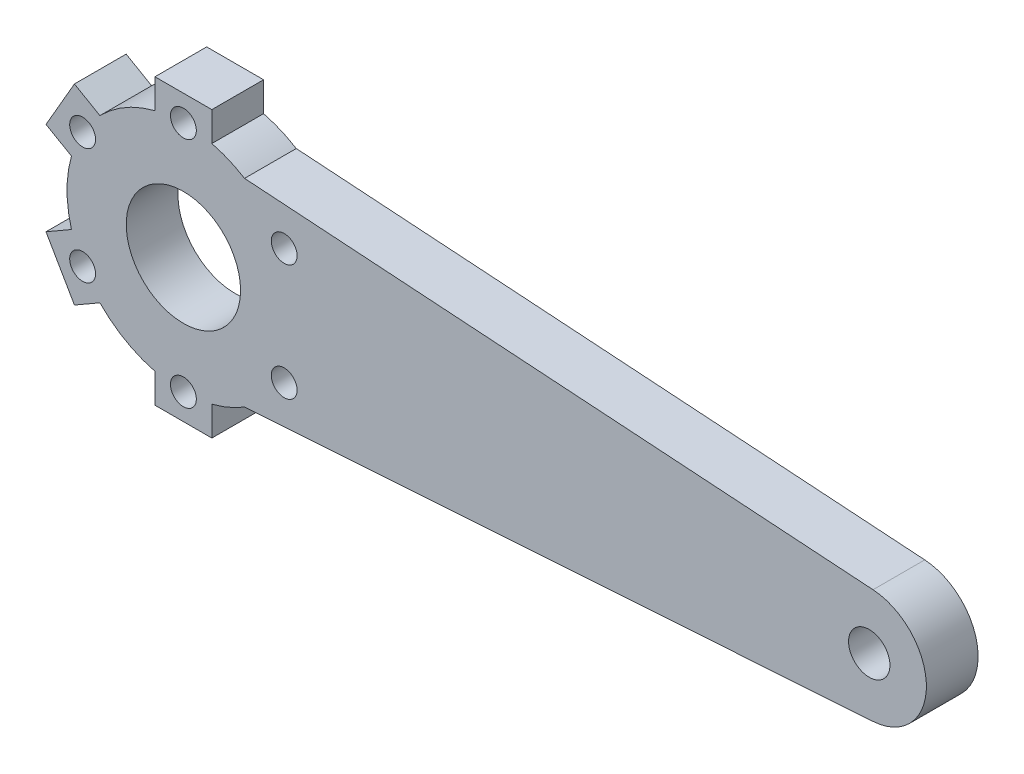
ISO-10303-21;
HEADER;
FILE_DESCRIPTION(('STEP AP214'),'2;1');
FILE_NAME('part.step','',(''),(''),'','','');
FILE_SCHEMA(('AUTOMOTIVE_DESIGN { 1 0 10303 214 1 1 1 1 }'));
ENDSEC;
DATA;
#1=APPLICATION_CONTEXT('core data for automotive mechanical design processes');
#2=APPLICATION_PROTOCOL_DEFINITION('international standard','automotive_design',2000,#1);
#3=PRODUCT_CONTEXT('',#1,'mechanical');
#4=PRODUCT('Part','Part','',(#3));
#5=PRODUCT_RELATED_PRODUCT_CATEGORY('part','',(#4));
#6=PRODUCT_DEFINITION_FORMATION('','',#4);
#7=PRODUCT_DEFINITION_CONTEXT('part definition',#1,'design');
#8=PRODUCT_DEFINITION('design','',#6,#7);
#9=PRODUCT_DEFINITION_SHAPE('','',#8);
#10=(LENGTH_UNIT() NAMED_UNIT(*) SI_UNIT(.MILLI.,.METRE.));
#11=(NAMED_UNIT(*) PLANE_ANGLE_UNIT() SI_UNIT($,.RADIAN.));
#12=(NAMED_UNIT(*) SI_UNIT($,.STERADIAN.) SOLID_ANGLE_UNIT());
#13=UNCERTAINTY_MEASURE_WITH_UNIT(LENGTH_MEASURE(1.E-05),#10,'distance_accuracy_value','');
#14=(GEOMETRIC_REPRESENTATION_CONTEXT(3) GLOBAL_UNCERTAINTY_ASSIGNED_CONTEXT((#13)) GLOBAL_UNIT_ASSIGNED_CONTEXT((#10,
#11,#12)) REPRESENTATION_CONTEXT('',''));
#15=CARTESIAN_POINT('',(0.,0.,0.));
#16=DIRECTION('',(0.,0.,1.));
#17=DIRECTION('',(1.,0.,0.));
#18=AXIS2_PLACEMENT_3D('',#15,#16,#17);
#19=CARTESIAN_POINT('',(-2.75000000000136,-4.76313972081565,10.));
#20=DIRECTION('',(0.500000000000088,0.866025403784388,0.));
#21=DIRECTION('',(-0.866025403784388,0.500000000000088,0.));
#22=AXIS2_PLACEMENT_3D('',#19,#20,#21);
#23=PLANE('',#22);
#24=DIRECTION('',(0.866025403784388,-0.500000000000088,0.));
#25=VECTOR('',#24,1.);
#26=CARTESIAN_POINT('',(-2.75000000000136,-4.76313972081565,0.));
#27=LINE('',#26,#25);
#28=CARTESIAN_POINT('',(-26.5656986040667,8.9868602791837,0.));
#29=VERTEX_POINT('',#28);
#30=CARTESIAN_POINT('',(-21.6444436276888,6.14557239381967,0.));
#31=VERTEX_POINT('',#30);
#32=EDGE_CURVE('E230',#29,#31,#27,.T.);
#33=ORIENTED_EDGE('',*,*,#32,.T.);
#34=DIRECTION('',(0.,0.,-1.));
#35=VECTOR('',#34,1.);
#36=CARTESIAN_POINT('',(-21.6444436276888,6.14557239381967,10.));
#37=LINE('',#36,#35);
#38=CARTESIAN_POINT('',(-21.6444436276888,6.14557239381967,10.));
#39=VERTEX_POINT('',#38);
#40=EDGE_CURVE('E11',#39,#31,#37,.T.);
#41=ORIENTED_EDGE('',*,*,#40,.F.);
#42=DIRECTION('',(0.866025403784388,-0.500000000000088,0.));
#43=VECTOR('',#42,1.);
#44=CARTESIAN_POINT('',(-2.75000000000136,-4.76313972081565,10.));
#45=LINE('',#44,#43);
#46=CARTESIAN_POINT('',(-26.5656986040667,8.9868602791837,10.));
#47=VERTEX_POINT('',#46);
#48=EDGE_CURVE('E295',#47,#39,#45,.T.);
#49=ORIENTED_EDGE('',*,*,#48,.F.);
#50=DIRECTION('',(0.,0.,-1.));
#51=VECTOR('',#50,1.);
#52=CARTESIAN_POINT('',(-26.5656986040667,8.9868602791837,10.));
#53=LINE('',#52,#51);
#54=EDGE_CURVE('E229',#47,#29,#53,.T.);
#55=ORIENTED_EDGE('',*,*,#54,.T.);
#56=EDGE_LOOP('',(#33,#41,#49,#55));
#57=FACE_BOUND('',#56,.T.);
#58=ADVANCED_FACE('F36',(#57),#23,.F.);
#59=CARTESIAN_POINT('',(0.,0.,10.));
#60=DIRECTION('',(0.,0.,-1.));
#61=DIRECTION('',(-1.,0.,0.));
#62=AXIS2_PLACEMENT_3D('',#59,#60,#61);
#63=CYLINDRICAL_SURFACE('',#62,22.5);
#64=CARTESIAN_POINT('',(0.,0.,0.));
#65=DIRECTION('',(0.,0.,1.));
#66=DIRECTION('',(1.,0.,0.));
#67=AXIS2_PLACEMENT_3D('',#64,#65,#66);
#68=CIRCLE('',#67,22.5);
#69=CARTESIAN_POINT('',(-21.6444436276863,-6.14557239382121,0.));
#70=VERTEX_POINT('',#69);
#71=EDGE_CURVE('E233',#31,#70,#68,.T.);
#72=ORIENTED_EDGE('',*,*,#71,.T.);
#73=DIRECTION('',(0.,0.,-1.));
#74=VECTOR('',#73,1.);
#75=CARTESIAN_POINT('',(-21.6444436276863,-6.14557239382121,10.));
#76=LINE('',#75,#74);
#77=CARTESIAN_POINT('',(-21.6444436276863,-6.14557239382121,10.));
#78=VERTEX_POINT('',#77);
#79=EDGE_CURVE('E44',#78,#70,#76,.T.);
#80=ORIENTED_EDGE('',*,*,#79,.F.);
#81=CARTESIAN_POINT('',(0.,0.,10.));
#82=DIRECTION('',(0.,0.,1.));
#83=DIRECTION('',(1.,0.,0.));
#84=AXIS2_PLACEMENT_3D('',#81,#82,#83);
#85=CIRCLE('',#84,22.5);
#86=EDGE_CURVE('E127',#39,#78,#85,.T.);
#87=ORIENTED_EDGE('',*,*,#86,.F.);
#88=ORIENTED_EDGE('',*,*,#40,.T.);
#89=EDGE_LOOP('',(#72,#80,#87,#88));
#90=FACE_BOUND('',#89,.T.);
#91=ADVANCED_FACE('F339',(#90),#63,.T.);
#92=CARTESIAN_POINT('',(-2.74999999999504,4.76313972080807,10.));
#93=DIRECTION('',(-0.499999999999823,0.866025403784541,0.));
#94=DIRECTION('',(-0.866025403784541,-0.499999999999823,0.));
#95=AXIS2_PLACEMENT_3D('',#92,#93,#94);
#96=PLANE('',#95);
#97=DIRECTION('',(0.866025403784541,0.499999999999823,0.));
#98=VECTOR('',#97,1.);
#99=CARTESIAN_POINT('',(-2.74999999999504,4.76313972080807,0.));
#100=LINE('',#99,#98);
#101=CARTESIAN_POINT('',(-26.5656986040633,-8.98686027918321,0.));
#102=VERTEX_POINT('',#101);
#103=EDGE_CURVE('E236',#102,#70,#100,.T.);
#104=ORIENTED_EDGE('',*,*,#103,.F.);
#105=DIRECTION('',(0.,0.,-1.));
#106=VECTOR('',#105,1.);
#107=CARTESIAN_POINT('',(-26.5656986040633,-8.98686027918321,10.));
#108=LINE('',#107,#106);
#109=CARTESIAN_POINT('',(-26.5656986040633,-8.98686027918321,10.));
#110=VERTEX_POINT('',#109);
#111=EDGE_CURVE('E332',#110,#102,#108,.T.);
#112=ORIENTED_EDGE('',*,*,#111,.F.);
#113=DIRECTION('',(0.866025403784541,0.499999999999823,0.));
#114=VECTOR('',#113,1.);
#115=CARTESIAN_POINT('',(-2.74999999999504,4.76313972080807,10.));
#116=LINE('',#115,#114);
#117=EDGE_CURVE('E338',#110,#78,#116,.T.);
#118=ORIENTED_EDGE('',*,*,#117,.T.);
#119=ORIENTED_EDGE('',*,*,#79,.T.);
#120=EDGE_LOOP('',(#104,#112,#118,#119));
#121=FACE_BOUND('',#120,.T.);
#122=ADVANCED_FACE('F336',(#121),#96,.T.);
#123=CARTESIAN_POINT('',(-23.8156986040682,-13.7499999999913,10.));
#124=DIRECTION('',(0.866025403784541,0.499999999999823,0.));
#125=DIRECTION('',(-0.499999999999823,0.866025403784541,0.));
#126=AXIS2_PLACEMENT_3D('',#123,#124,#125);
#127=PLANE('',#126);
#128=DIRECTION('',(0.499999999999823,-0.866025403784541,0.));
#129=VECTOR('',#128,1.);
#130=CARTESIAN_POINT('',(-23.8156986040682,-13.7499999999913,0.));
#131=LINE('',#130,#129);
#132=CARTESIAN_POINT('',(-21.0656986040652,-18.5131397208132,0.));
#133=VERTEX_POINT('',#132);
#134=EDGE_CURVE('E240',#102,#133,#131,.T.);
#135=ORIENTED_EDGE('',*,*,#134,.T.);
#136=DIRECTION('',(0.,0.,-1.));
#137=VECTOR('',#136,1.);
#138=CARTESIAN_POINT('',(-21.0656986040652,-18.5131397208132,10.));
#139=LINE('',#138,#137);
#140=CARTESIAN_POINT('',(-21.0656986040652,-18.5131397208132,10.));
#141=VERTEX_POINT('',#140);
#142=EDGE_CURVE('E329',#141,#133,#139,.T.);
#143=ORIENTED_EDGE('',*,*,#142,.F.);
#144=DIRECTION('',(0.499999999999823,-0.866025403784541,0.));
#145=VECTOR('',#144,1.);
#146=CARTESIAN_POINT('',(-23.8156986040682,-13.7499999999913,10.));
#147=LINE('',#146,#145);
#148=EDGE_CURVE('E359',#110,#141,#147,.T.);
#149=ORIENTED_EDGE('',*,*,#148,.F.);
#150=ORIENTED_EDGE('',*,*,#111,.T.);
#151=EDGE_LOOP('',(#135,#143,#149,#150));
#152=FACE_BOUND('',#151,.T.);
#153=ADVANCED_FACE('F350',(#152),#127,.F.);
#154=CARTESIAN_POINT('',(2.75000000000301,-4.76313972082188,10.));
#155=DIRECTION('',(-0.499999999999823,0.866025403784541,0.));
#156=DIRECTION('',(-0.866025403784541,-0.499999999999823,0.));
#157=AXIS2_PLACEMENT_3D('',#154,#155,#156);
#158=PLANE('',#157);
#159=DIRECTION('',(0.866025403784541,0.499999999999823,0.));
#160=VECTOR('',#159,1.);
#161=CARTESIAN_POINT('',(2.75000000000301,-4.76313972082188,0.));
#162=LINE('',#161,#160);
#163=CARTESIAN_POINT('',(-16.1444436276857,-15.6718518354518,0.));
#164=VERTEX_POINT('',#163);
#165=EDGE_CURVE('E242',#133,#164,#162,.T.);
#166=ORIENTED_EDGE('',*,*,#165,.T.);
#167=DIRECTION('',(0.,0.,-1.));
#168=VECTOR('',#167,1.);
#169=CARTESIAN_POINT('',(-16.1444436276857,-15.6718518354518,10.));
#170=LINE('',#169,#168);
#171=CARTESIAN_POINT('',(-16.1444436276857,-15.6718518354518,10.));
#172=VERTEX_POINT('',#171);
#173=EDGE_CURVE('E326',#172,#164,#170,.T.);
#174=ORIENTED_EDGE('',*,*,#173,.F.);
#175=DIRECTION('',(0.866025403784541,0.499999999999823,0.));
#176=VECTOR('',#175,1.);
#177=CARTESIAN_POINT('',(2.75000000000301,-4.76313972082188,10.));
#178=LINE('',#177,#176);
#179=EDGE_CURVE('E356',#141,#172,#178,.T.);
#180=ORIENTED_EDGE('',*,*,#179,.F.);
#181=ORIENTED_EDGE('',*,*,#142,.T.);
#182=EDGE_LOOP('',(#166,#174,#180,#181));
#183=FACE_BOUND('',#182,.T.);
#184=ADVANCED_FACE('F354',(#183),#158,.F.);
#185=CARTESIAN_POINT('',(-5.49999999999502,-21.8174242292696,0.));
#186=VERTEX_POINT('',#185);
#187=EDGE_CURVE('E237',#164,#186,#68,.T.);
#188=ORIENTED_EDGE('',*,*,#187,.T.);
#189=DIRECTION('',(0.,0.,-1.));
#190=VECTOR('',#189,1.);
#191=CARTESIAN_POINT('',(-5.49999999999502,-21.8174242292696,10.));
#192=LINE('',#191,#190);
#193=CARTESIAN_POINT('',(-5.49999999999502,-21.8174242292696,10.));
#194=VERTEX_POINT('',#193);
#195=EDGE_CURVE('E324',#194,#186,#192,.T.);
#196=ORIENTED_EDGE('',*,*,#195,.F.);
#197=EDGE_CURVE('E358',#172,#194,#85,.T.);
#198=ORIENTED_EDGE('',*,*,#197,.F.);
#199=ORIENTED_EDGE('',*,*,#173,.T.);
#200=EDGE_LOOP('',(#188,#196,#198,#199));
#201=FACE_BOUND('',#200,.T.);
#202=ADVANCED_FACE('F401',(#201),#63,.T.);
#203=CARTESIAN_POINT('',(-5.49999999998757,1.6915808691456E-12,10.));
#204=DIRECTION('',(-1.,3.07560158027167E-13,0.));
#205=DIRECTION('',(-3.07560158027167E-13,-1.,0.));
#206=AXIS2_PLACEMENT_3D('',#203,#204,#205);
#207=PLANE('',#206);
#208=DIRECTION('',(3.07560158027167E-13,1.,0.));
#209=VECTOR('',#208,1.);
#210=CARTESIAN_POINT('',(-5.49999999998757,1.6915808691456E-12,0.));
#211=LINE('',#210,#209);
#212=CARTESIAN_POINT('',(-5.49999999999603,-27.4999999999952,0.));
#213=VERTEX_POINT('',#212);
#214=EDGE_CURVE('E244',#213,#186,#211,.T.);
#215=ORIENTED_EDGE('',*,*,#214,.F.);
#216=DIRECTION('',(0.,0.,-1.));
#217=VECTOR('',#216,1.);
#218=CARTESIAN_POINT('',(-5.49999999999603,-27.4999999999952,10.));
#219=LINE('',#218,#217);
#220=CARTESIAN_POINT('',(-5.49999999999603,-27.4999999999952,10.));
#221=VERTEX_POINT('',#220);
#222=EDGE_CURVE('E322',#221,#213,#219,.T.);
#223=ORIENTED_EDGE('',*,*,#222,.F.);
#224=DIRECTION('',(3.07560158027167E-13,1.,0.));
#225=VECTOR('',#224,1.);
#226=CARTESIAN_POINT('',(-5.49999999998757,1.6915808691456E-12,10.));
#227=LINE('',#226,#225);
#228=EDGE_CURVE('E361',#221,#194,#227,.T.);
#229=ORIENTED_EDGE('',*,*,#228,.T.);
#230=ORIENTED_EDGE('',*,*,#195,.T.);
#231=EDGE_LOOP('',(#215,#223,#229,#230));
#232=FACE_BOUND('',#231,.T.);
#233=ADVANCED_FACE('F406',(#232),#207,.T.);
#234=CARTESIAN_POINT('',(-8.4481033280061E-12,-27.4999999999969,10.));
#235=DIRECTION('',(3.07203757382075E-13,1.,0.));
#236=DIRECTION('',(-1.,3.07203757382075E-13,0.));
#237=AXIS2_PLACEMENT_3D('',#234,#235,#236);
#238=PLANE('',#237);
#239=DIRECTION('',(1.,-3.07203757382075E-13,0.));
#240=VECTOR('',#239,1.);
#241=CARTESIAN_POINT('',(-8.4481033280061E-12,-27.4999999999969,0.));
#242=LINE('',#241,#240);
#243=CARTESIAN_POINT('',(5.50000000000397,-27.4999999999986,0.));
#244=VERTEX_POINT('',#243);
#245=EDGE_CURVE('E247',#213,#244,#242,.T.);
#246=ORIENTED_EDGE('',*,*,#245,.T.);
#247=DIRECTION('',(0.,0.,-1.));
#248=VECTOR('',#247,1.);
#249=CARTESIAN_POINT('',(5.50000000000397,-27.4999999999986,10.));
#250=LINE('',#249,#248);
#251=CARTESIAN_POINT('',(5.50000000000397,-27.4999999999986,10.));
#252=VERTEX_POINT('',#251);
#253=EDGE_CURVE('E319',#252,#244,#250,.T.);
#254=ORIENTED_EDGE('',*,*,#253,.F.);
#255=DIRECTION('',(1.,-3.07203757382075E-13,0.));
#256=VECTOR('',#255,1.);
#257=CARTESIAN_POINT('',(-8.4481033280061E-12,-27.4999999999969,10.));
#258=LINE('',#257,#256);
#259=EDGE_CURVE('E368',#221,#252,#258,.T.);
#260=ORIENTED_EDGE('',*,*,#259,.F.);
#261=ORIENTED_EDGE('',*,*,#222,.T.);
#262=EDGE_LOOP('',(#246,#254,#260,#261));
#263=FACE_BOUND('',#262,.T.);
#264=ADVANCED_FACE('F413',(#263),#238,.F.);
#265=CARTESIAN_POINT('',(5.50000000001242,-1.6899018806975E-12,10.));
#266=DIRECTION('',(-1.,3.07254887398853E-13,0.));
#267=DIRECTION('',(-3.07254887398853E-13,-1.,0.));
#268=AXIS2_PLACEMENT_3D('',#265,#266,#267);
#269=PLANE('',#268);
#270=DIRECTION('',(3.07254887398853E-13,1.,0.));
#271=VECTOR('',#270,1.);
#272=CARTESIAN_POINT('',(5.50000000001242,-1.6899018806975E-12,0.));
#273=LINE('',#272,#271);
#274=CARTESIAN_POINT('',(5.50000000000571,-21.81742422927,0.));
#275=VERTEX_POINT('',#274);
#276=EDGE_CURVE('E249',#244,#275,#273,.T.);
#277=ORIENTED_EDGE('',*,*,#276,.T.);
#278=DIRECTION('',(0.,0.,-1.));
#279=VECTOR('',#278,1.);
#280=CARTESIAN_POINT('',(5.50000000000571,-21.81742422927,10.));
#281=LINE('',#280,#279);
#282=CARTESIAN_POINT('',(5.50000000000571,-21.81742422927,10.));
#283=VERTEX_POINT('',#282);
#284=EDGE_CURVE('E316',#283,#275,#281,.T.);
#285=ORIENTED_EDGE('',*,*,#284,.F.);
#286=DIRECTION('',(3.07254887398853E-13,1.,0.));
#287=VECTOR('',#286,1.);
#288=CARTESIAN_POINT('',(5.50000000001242,-1.6899018806975E-12,10.));
#289=LINE('',#288,#287);
#290=EDGE_CURVE('E370',#252,#283,#289,.T.);
#291=ORIENTED_EDGE('',*,*,#290,.F.);
#292=ORIENTED_EDGE('',*,*,#253,.T.);
#293=EDGE_LOOP('',(#277,#285,#291,#292));
#294=FACE_BOUND('',#293,.T.);
#295=ADVANCED_FACE('F415',(#294),#269,.F.);
#296=CARTESIAN_POINT('',(11.8210548362267,-19.1445204316776,0.));
#297=VERTEX_POINT('',#296);
#298=EDGE_CURVE('E251',#275,#297,#68,.T.);
#299=ORIENTED_EDGE('',*,*,#298,.T.);
#300=DIRECTION('',(0.,0.,-1.));
#301=VECTOR('',#300,1.);
#302=CARTESIAN_POINT('',(11.8210548362267,-19.1445204316776,10.));
#303=LINE('',#302,#301);
#304=CARTESIAN_POINT('',(11.8210548362267,-19.1445204316776,10.));
#305=VERTEX_POINT('',#304);
#306=EDGE_CURVE('E313',#305,#297,#303,.T.);
#307=ORIENTED_EDGE('',*,*,#306,.F.);
#308=EDGE_CURVE('E362',#283,#305,#85,.T.);
#309=ORIENTED_EDGE('',*,*,#308,.F.);
#310=ORIENTED_EDGE('',*,*,#284,.T.);
#311=EDGE_LOOP('',(#299,#307,#309,#310));
#312=FACE_BOUND('',#311,.T.);
#313=ADVANCED_FACE('F417',(#312),#63,.T.);
#314=CARTESIAN_POINT('',(1.32600000076081,-19.8457507793981,10.));
#315=DIRECTION('',(-0.0666666667049174,0.997775303137162,0.));
#316=DIRECTION('',(-0.997775303137162,-0.0666666667049174,0.));
#317=AXIS2_PLACEMENT_3D('',#314,#315,#316);
#318=PLANE('',#317);
#319=DIRECTION('',(0.997775303137162,0.0666666667049174,0.));
#320=VECTOR('',#319,1.);
#321=CARTESIAN_POINT('',(1.32600000076081,-19.8457507793981,0.));
#322=LINE('',#321,#320);
#323=CARTESIAN_POINT('',(133.336666591008,-11.0254170996656,0.));
#324=VERTEX_POINT('',#323);
#325=EDGE_CURVE('E252',#297,#324,#322,.T.);
#326=ORIENTED_EDGE('',*,*,#325,.T.);
#327=DIRECTION('',(0.,0.,-1.));
#328=VECTOR('',#327,1.);
#329=CARTESIAN_POINT('',(133.336666591008,-11.0254170996656,10.));
#330=LINE('',#329,#328);
#331=CARTESIAN_POINT('',(133.336666591008,-11.0254170996656,10.));
#332=VERTEX_POINT('',#331);
#333=EDGE_CURVE('E310',#332,#324,#330,.T.);
#334=ORIENTED_EDGE('',*,*,#333,.F.);
#335=DIRECTION('',(0.997775303137162,0.0666666667049174,0.));
#336=VECTOR('',#335,1.);
#337=CARTESIAN_POINT('',(1.32600000076081,-19.8457507793981,10.));
#338=LINE('',#337,#336);
#339=EDGE_CURVE('E372',#305,#332,#338,.T.);
#340=ORIENTED_EDGE('',*,*,#339,.F.);
#341=ORIENTED_EDGE('',*,*,#306,.T.);
#342=EDGE_LOOP('',(#326,#334,#340,#341));
#343=FACE_BOUND('',#342,.T.);
#344=ADVANCED_FACE('F437',(#343),#318,.F.);
#345=CARTESIAN_POINT('',(132.599999923919,0.,10.));
#346=DIRECTION('',(0.,0.,-1.));
#347=DIRECTION('',(-1.,0.,0.));
#348=AXIS2_PLACEMENT_3D('',#345,#346,#347);
#349=CYLINDRICAL_SURFACE('',#348,11.05);
#350=CARTESIAN_POINT('',(132.599999923919,0.,0.));
#351=DIRECTION('',(0.,0.,1.));
#352=DIRECTION('',(1.,0.,0.));
#353=AXIS2_PLACEMENT_3D('',#350,#351,#352);
#354=CIRCLE('',#353,11.05);
#355=CARTESIAN_POINT('',(133.336666591008,11.0254170996656,0.));
#356=VERTEX_POINT('',#355);
#357=EDGE_CURVE('E254',#324,#356,#354,.T.);
#358=ORIENTED_EDGE('',*,*,#357,.T.);
#359=DIRECTION('',(0.,0.,-1.));
#360=VECTOR('',#359,1.);
#361=CARTESIAN_POINT('',(133.336666591008,11.0254170996656,10.));
#362=LINE('',#361,#360);
#363=CARTESIAN_POINT('',(133.336666591008,11.0254170996656,10.));
#364=VERTEX_POINT('',#363);
#365=EDGE_CURVE('E308',#364,#356,#362,.T.);
#366=ORIENTED_EDGE('',*,*,#365,.F.);
#367=CARTESIAN_POINT('',(132.599999923919,0.,10.));
#368=DIRECTION('',(0.,0.,1.));
#369=DIRECTION('',(1.,0.,0.));
#370=AXIS2_PLACEMENT_3D('',#367,#368,#369);
#371=CIRCLE('',#370,11.05);
#372=EDGE_CURVE('E374',#332,#364,#371,.T.);
#373=ORIENTED_EDGE('',*,*,#372,.F.);
#374=ORIENTED_EDGE('',*,*,#333,.T.);
#375=EDGE_LOOP('',(#358,#366,#373,#374));
#376=FACE_BOUND('',#375,.T.);
#377=ADVANCED_FACE('F433',(#376),#349,.T.);
#378=CARTESIAN_POINT('',(1.32600000076081,19.8457507793981,10.));
#379=DIRECTION('',(0.0666666667049174,0.997775303137162,0.));
#380=DIRECTION('',(-0.997775303137162,0.0666666667049174,0.));
#381=AXIS2_PLACEMENT_3D('',#378,#379,#380);
#382=PLANE('',#381);
#383=DIRECTION('',(0.997775303137162,-0.0666666667049174,0.));
#384=VECTOR('',#383,1.);
#385=CARTESIAN_POINT('',(1.32600000076081,19.8457507793981,0.));
#386=LINE('',#385,#384);
#387=CARTESIAN_POINT('',(11.8210548362267,19.1445204316776,0.));
#388=VERTEX_POINT('',#387);
#389=EDGE_CURVE('E257',#388,#356,#386,.T.);
#390=ORIENTED_EDGE('',*,*,#389,.F.);
#391=DIRECTION('',(0.,0.,-1.));
#392=VECTOR('',#391,1.);
#393=CARTESIAN_POINT('',(11.8210548362267,19.1445204316776,10.));
#394=LINE('',#393,#392);
#395=CARTESIAN_POINT('',(11.8210548362267,19.1445204316776,10.));
#396=VERTEX_POINT('',#395);
#397=EDGE_CURVE('E306',#396,#388,#394,.T.);
#398=ORIENTED_EDGE('',*,*,#397,.F.);
#399=DIRECTION('',(0.997775303137162,-0.0666666667049174,0.));
#400=VECTOR('',#399,1.);
#401=CARTESIAN_POINT('',(1.32600000076081,19.8457507793981,10.));
#402=LINE('',#401,#400);
#403=EDGE_CURVE('E376',#396,#364,#402,.T.);
#404=ORIENTED_EDGE('',*,*,#403,.T.);
#405=ORIENTED_EDGE('',*,*,#365,.T.);
#406=EDGE_LOOP('',(#390,#398,#404,#405));
#407=FACE_BOUND('',#406,.T.);
#408=ADVANCED_FACE('F429',(#407),#382,.T.);
#409=CARTESIAN_POINT('',(5.5,21.8174242292714,0.));
#410=VERTEX_POINT('',#409);
#411=EDGE_CURVE('E260',#388,#410,#68,.T.);
#412=ORIENTED_EDGE('',*,*,#411,.T.);
#413=DIRECTION('',(0.,0.,-1.));
#414=VECTOR('',#413,1.);
#415=CARTESIAN_POINT('',(5.5,21.8174242292714,10.));
#416=LINE('',#415,#414);
#417=CARTESIAN_POINT('',(5.5,21.8174242292714,10.));
#418=VERTEX_POINT('',#417);
#419=EDGE_CURVE('E304',#418,#410,#416,.T.);
#420=ORIENTED_EDGE('',*,*,#419,.F.);
#421=EDGE_CURVE('E188',#396,#418,#85,.T.);
#422=ORIENTED_EDGE('',*,*,#421,.F.);
#423=ORIENTED_EDGE('',*,*,#397,.T.);
#424=EDGE_LOOP('',(#412,#420,#422,#423));
#425=FACE_BOUND('',#424,.T.);
#426=ADVANCED_FACE('F422',(#425),#63,.T.);
#427=CARTESIAN_POINT('',(5.5,0.,10.));
#428=DIRECTION('',(1.,0.,0.));
#429=DIRECTION('',(0.,0.,-1.));
#430=AXIS2_PLACEMENT_3D('',#427,#428,#429);
#431=PLANE('',#430);
#432=DIRECTION('',(0.,-1.,0.));
#433=VECTOR('',#432,1.);
#434=CARTESIAN_POINT('',(5.5,0.,0.));
#435=LINE('',#434,#433);
#436=CARTESIAN_POINT('',(5.5,27.5,0.));
#437=VERTEX_POINT('',#436);
#438=EDGE_CURVE('E261',#437,#410,#435,.T.);
#439=ORIENTED_EDGE('',*,*,#438,.F.);
#440=DIRECTION('',(0.,0.,-1.));
#441=VECTOR('',#440,1.);
#442=CARTESIAN_POINT('',(5.5,27.5,10.));
#443=LINE('',#442,#441);
#444=CARTESIAN_POINT('',(5.5,27.5,10.));
#445=VERTEX_POINT('',#444);
#446=EDGE_CURVE('E302',#445,#437,#443,.T.);
#447=ORIENTED_EDGE('',*,*,#446,.F.);
#448=DIRECTION('',(0.,-1.,0.));
#449=VECTOR('',#448,1.);
#450=CARTESIAN_POINT('',(5.5,0.,10.));
#451=LINE('',#450,#449);
#452=EDGE_CURVE('E379',#445,#418,#451,.T.);
#453=ORIENTED_EDGE('',*,*,#452,.T.);
#454=ORIENTED_EDGE('',*,*,#419,.T.);
#455=EDGE_LOOP('',(#439,#447,#453,#454));
#456=FACE_BOUND('',#455,.T.);
#457=ADVANCED_FACE('F425',(#456),#431,.T.);
#458=CARTESIAN_POINT('',(0.,27.5,10.));
#459=DIRECTION('',(0.,-1.,0.));
#460=DIRECTION('',(0.,0.,-1.));
#461=AXIS2_PLACEMENT_3D('',#458,#459,#460);
#462=PLANE('',#461);
#463=DIRECTION('',(-1.,0.,0.));
#464=VECTOR('',#463,1.);
#465=CARTESIAN_POINT('',(0.,27.5,0.));
#466=LINE('',#465,#464);
#467=CARTESIAN_POINT('',(-5.5,27.5,0.));
#468=VERTEX_POINT('',#467);
#469=EDGE_CURVE('E264',#437,#468,#466,.T.);
#470=ORIENTED_EDGE('',*,*,#469,.T.);
#471=DIRECTION('',(0.,0.,-1.));
#472=VECTOR('',#471,1.);
#473=CARTESIAN_POINT('',(-5.5,27.5,10.));
#474=LINE('',#473,#472);
#475=CARTESIAN_POINT('',(-5.5,27.5,10.));
#476=VERTEX_POINT('',#475);
#477=EDGE_CURVE('E299',#476,#468,#474,.T.);
#478=ORIENTED_EDGE('',*,*,#477,.F.);
#479=DIRECTION('',(-1.,0.,0.));
#480=VECTOR('',#479,1.);
#481=CARTESIAN_POINT('',(0.,27.5,10.));
#482=LINE('',#481,#480);
#483=EDGE_CURVE('E381',#445,#476,#482,.T.);
#484=ORIENTED_EDGE('',*,*,#483,.F.);
#485=ORIENTED_EDGE('',*,*,#446,.T.);
#486=EDGE_LOOP('',(#470,#478,#484,#485));
#487=FACE_BOUND('',#486,.T.);
#488=ADVANCED_FACE('F386',(#487),#462,.F.);
#489=CARTESIAN_POINT('',(-5.5,0.,10.));
#490=DIRECTION('',(1.,0.,0.));
#491=DIRECTION('',(0.,0.,-1.));
#492=AXIS2_PLACEMENT_3D('',#489,#490,#491);
#493=PLANE('',#492);
#494=DIRECTION('',(0.,-1.,0.));
#495=VECTOR('',#494,1.);
#496=CARTESIAN_POINT('',(-5.5,0.,0.));
#497=LINE('',#496,#495);
#498=CARTESIAN_POINT('',(-5.5,21.8174242292714,0.));
#499=VERTEX_POINT('',#498);
#500=EDGE_CURVE('E266',#468,#499,#497,.T.);
#501=ORIENTED_EDGE('',*,*,#500,.T.);
#502=DIRECTION('',(0.,0.,-1.));
#503=VECTOR('',#502,1.);
#504=CARTESIAN_POINT('',(-5.5,21.8174242292714,10.));
#505=LINE('',#504,#503);
#506=CARTESIAN_POINT('',(-5.5,21.8174242292714,10.));
#507=VERTEX_POINT('',#506);
#508=EDGE_CURVE('E197',#507,#499,#505,.T.);
#509=ORIENTED_EDGE('',*,*,#508,.F.);
#510=DIRECTION('',(0.,-1.,0.));
#511=VECTOR('',#510,1.);
#512=CARTESIAN_POINT('',(-5.5,0.,10.));
#513=LINE('',#512,#511);
#514=EDGE_CURVE('E183',#476,#507,#513,.T.);
#515=ORIENTED_EDGE('',*,*,#514,.F.);
#516=ORIENTED_EDGE('',*,*,#477,.T.);
#517=EDGE_LOOP('',(#501,#509,#515,#516));
#518=FACE_BOUND('',#517,.T.);
#519=ADVANCED_FACE('F390',(#518),#493,.F.);
#520=CARTESIAN_POINT('',(-16.1444436276874,15.6718518354494,0.));
#521=VERTEX_POINT('',#520);
#522=EDGE_CURVE('E193',#499,#521,#68,.T.);
#523=ORIENTED_EDGE('',*,*,#522,.T.);
#524=DIRECTION('',(0.,0.,-1.));
#525=VECTOR('',#524,1.);
#526=CARTESIAN_POINT('',(-16.1444436276874,15.6718518354494,10.));
#527=LINE('',#526,#525);
#528=CARTESIAN_POINT('',(-16.1444436276874,15.6718518354494,10.));
#529=VERTEX_POINT('',#528);
#530=EDGE_CURVE('E190',#529,#521,#527,.T.);
#531=ORIENTED_EDGE('',*,*,#530,.F.);
#532=EDGE_CURVE('E176',#507,#529,#85,.T.);
#533=ORIENTED_EDGE('',*,*,#532,.F.);
#534=ORIENTED_EDGE('',*,*,#508,.T.);
#535=EDGE_LOOP('',(#523,#531,#533,#534));
#536=FACE_BOUND('',#535,.T.);
#537=ADVANCED_FACE('F191',(#536),#63,.T.);
#538=CARTESIAN_POINT('',(2.7499999999996,4.76313972081259,10.));
#539=DIRECTION('',(0.500000000000089,0.866025403784387,0.));
#540=DIRECTION('',(-0.866025403784387,0.500000000000089,0.));
#541=AXIS2_PLACEMENT_3D('',#538,#539,#540);
#542=PLANE('',#541);
#543=DIRECTION('',(0.866025403784387,-0.500000000000089,0.));
#544=VECTOR('',#543,1.);
#545=CARTESIAN_POINT('',(2.7499999999996,4.76313972081259,0.));
#546=LINE('',#545,#544);
#547=CARTESIAN_POINT('',(-21.0656986040657,18.513139720812,0.));
#548=VERTEX_POINT('',#547);
#549=EDGE_CURVE('E268',#548,#521,#546,.T.);
#550=ORIENTED_EDGE('',*,*,#549,.F.);
#551=DIRECTION('',(0.,0.,-1.));
#552=VECTOR('',#551,1.);
#553=CARTESIAN_POINT('',(-21.0656986040657,18.513139720812,10.));
#554=LINE('',#553,#552);
#555=CARTESIAN_POINT('',(-21.0656986040657,18.513139720812,10.));
#556=VERTEX_POINT('',#555);
#557=EDGE_CURVE('E116',#556,#548,#554,.T.);
#558=ORIENTED_EDGE('',*,*,#557,.F.);
#559=DIRECTION('',(0.866025403784387,-0.500000000000089,0.));
#560=VECTOR('',#559,1.);
#561=CARTESIAN_POINT('',(2.7499999999996,4.76313972081259,10.));
#562=LINE('',#561,#560);
#563=EDGE_CURVE('E181',#556,#529,#562,.T.);
#564=ORIENTED_EDGE('',*,*,#563,.T.);
#565=ORIENTED_EDGE('',*,*,#530,.T.);
#566=EDGE_LOOP('',(#550,#558,#564,#565));
#567=FACE_BOUND('',#566,.T.);
#568=ADVANCED_FACE('F199',(#567),#542,.T.);
#569=CARTESIAN_POINT('',(19.4855715851499,11.25,10.));
#570=DIRECTION('',(0.,0.,-1.));
#571=DIRECTION('',(-1.,0.,0.));
#572=AXIS2_PLACEMENT_3D('',#569,#570,#571);
#573=CYLINDRICAL_SURFACE('',#572,2.5);
#574=CARTESIAN_POINT('',(19.4855715851499,11.25,10.));
#575=DIRECTION('',(0.,0.,1.));
#576=DIRECTION('',(1.,0.,0.));
#577=AXIS2_PLACEMENT_3D('',#574,#575,#576);
#578=CIRCLE('',#577,2.5);
#579=CARTESIAN_POINT('',(21.9855715851499,11.25,10.));
#580=VERTEX_POINT('',#579);
#581=EDGE_CURVE('E223',#580,#580,#578,.T.);
#582=ORIENTED_EDGE('',*,*,#581,.T.);
#583=EDGE_LOOP('',(#582));
#584=FACE_BOUND('',#583,.T.);
#585=CARTESIAN_POINT('',(19.4855715851499,11.25,0.));
#586=DIRECTION('',(0.,0.,1.));
#587=DIRECTION('',(1.,0.,0.));
#588=AXIS2_PLACEMENT_3D('',#585,#586,#587);
#589=CIRCLE('',#588,2.5);
#590=CARTESIAN_POINT('',(21.9855715851499,11.25,0.));
#591=VERTEX_POINT('',#590);
#592=EDGE_CURVE('E289',#591,#591,#589,.T.);
#593=ORIENTED_EDGE('',*,*,#592,.F.);
#594=EDGE_LOOP('',(#593));
#595=FACE_BOUND('',#594,.T.);
#596=ADVANCED_FACE('F470',(#584,#595),#573,.F.);
#597=CARTESIAN_POINT('',(132.599999923919,0.,10.));
#598=DIRECTION('',(0.,0.,-1.));
#599=DIRECTION('',(-1.,0.,0.));
#600=AXIS2_PLACEMENT_3D('',#597,#598,#599);
#601=CYLINDRICAL_SURFACE('',#600,3.99999999999999);
#602=CARTESIAN_POINT('',(132.599999923919,0.,10.));
#603=DIRECTION('',(0.,0.,1.));
#604=DIRECTION('',(1.,0.,0.));
#605=AXIS2_PLACEMENT_3D('',#602,#603,#604);
#606=CIRCLE('',#605,3.99999999999999);
#607=CARTESIAN_POINT('',(136.599999923919,0.,10.));
#608=VERTEX_POINT('',#607);
#609=EDGE_CURVE('E220',#608,#608,#606,.T.);
#610=ORIENTED_EDGE('',*,*,#609,.T.);
#611=EDGE_LOOP('',(#610));
#612=FACE_BOUND('',#611,.T.);
#613=CARTESIAN_POINT('',(132.599999923919,0.,0.));
#614=DIRECTION('',(0.,0.,1.));
#615=DIRECTION('',(1.,0.,0.));
#616=AXIS2_PLACEMENT_3D('',#613,#614,#615);
#617=CIRCLE('',#616,3.99999999999999);
#618=CARTESIAN_POINT('',(136.599999923919,0.,0.));
#619=VERTEX_POINT('',#618);
#620=EDGE_CURVE('E286',#619,#619,#617,.T.);
#621=ORIENTED_EDGE('',*,*,#620,.F.);
#622=EDGE_LOOP('',(#621));
#623=FACE_BOUND('',#622,.T.);
#624=ADVANCED_FACE('F511',(#612,#623),#601,.F.);
#625=CARTESIAN_POINT('',(19.4855715851518,-11.2499999999989,10.));
#626=DIRECTION('',(0.,0.,-1.));
#627=DIRECTION('',(-1.,0.,0.));
#628=AXIS2_PLACEMENT_3D('',#625,#626,#627);
#629=CYLINDRICAL_SURFACE('',#628,2.50000000000161);
#630=CARTESIAN_POINT('',(19.4855715851518,-11.2499999999989,10.));
#631=DIRECTION('',(0.,0.,1.));
#632=DIRECTION('',(1.,0.,0.));
#633=AXIS2_PLACEMENT_3D('',#630,#631,#632);
#634=CIRCLE('',#633,2.50000000000161);
#635=CARTESIAN_POINT('',(21.9855715851534,-11.2499999999989,10.));
#636=VERTEX_POINT('',#635);
#637=EDGE_CURVE('E217',#636,#636,#634,.T.);
#638=ORIENTED_EDGE('',*,*,#637,.T.);
#639=EDGE_LOOP('',(#638));
#640=FACE_BOUND('',#639,.T.);
#641=CARTESIAN_POINT('',(19.4855715851518,-11.2499999999989,0.));
#642=DIRECTION('',(0.,0.,1.));
#643=DIRECTION('',(1.,0.,0.));
#644=AXIS2_PLACEMENT_3D('',#641,#642,#643);
#645=CIRCLE('',#644,2.50000000000161);
#646=CARTESIAN_POINT('',(21.9855715851534,-11.2499999999989,0.));
#647=VERTEX_POINT('',#646);
#648=EDGE_CURVE('E283',#647,#647,#645,.T.);
#649=ORIENTED_EDGE('',*,*,#648,.F.);
#650=EDGE_LOOP('',(#649));
#651=FACE_BOUND('',#650,.T.);
#652=ADVANCED_FACE('F519',(#640,#651),#629,.F.);
#653=CARTESIAN_POINT('',(-19.4855715851497,11.2500000000002,10.));
#654=DIRECTION('',(0.,0.,-1.));
#655=DIRECTION('',(-1.,0.,0.));
#656=AXIS2_PLACEMENT_3D('',#653,#654,#655);
#657=CYLINDRICAL_SURFACE('',#656,2.5);
#658=CARTESIAN_POINT('',(-19.4855715851497,11.2500000000002,10.));
#659=DIRECTION('',(0.,0.,1.));
#660=DIRECTION('',(1.,0.,0.));
#661=AXIS2_PLACEMENT_3D('',#658,#659,#660);
#662=CIRCLE('',#661,2.5);
#663=CARTESIAN_POINT('',(-16.9855715851497,11.2500000000002,10.));
#664=VERTEX_POINT('',#663);
#665=EDGE_CURVE('E214',#664,#664,#662,.T.);
#666=ORIENTED_EDGE('',*,*,#665,.T.);
#667=EDGE_LOOP('',(#666));
#668=FACE_BOUND('',#667,.T.);
#669=CARTESIAN_POINT('',(-19.4855715851497,11.2500000000002,0.));
#670=DIRECTION('',(0.,0.,1.));
#671=DIRECTION('',(1.,0.,0.));
#672=AXIS2_PLACEMENT_3D('',#669,#670,#671);
#673=CIRCLE('',#672,2.5);
#674=CARTESIAN_POINT('',(-16.9855715851497,11.2500000000002,0.));
#675=VERTEX_POINT('',#674);
#676=EDGE_CURVE('E280',#675,#675,#673,.T.);
#677=ORIENTED_EDGE('',*,*,#676,.F.);
#678=EDGE_LOOP('',(#677));
#679=FACE_BOUND('',#678,.T.);
#680=ADVANCED_FACE('F527',(#668,#679),#657,.F.);
#681=CARTESIAN_POINT('',(0.,22.5,10.));
#682=DIRECTION('',(0.,0.,-1.));
#683=DIRECTION('',(-1.,0.,0.));
#684=AXIS2_PLACEMENT_3D('',#681,#682,#683);
#685=CYLINDRICAL_SURFACE('',#684,2.5);
#686=CARTESIAN_POINT('',(0.,22.5,10.));
#687=DIRECTION('',(0.,0.,1.));
#688=DIRECTION('',(1.,0.,0.));
#689=AXIS2_PLACEMENT_3D('',#686,#687,#688);
#690=CIRCLE('',#689,2.5);
#691=CARTESIAN_POINT('',(2.5,22.5,10.));
#692=VERTEX_POINT('',#691);
#693=EDGE_CURVE('E211',#692,#692,#690,.T.);
#694=ORIENTED_EDGE('',*,*,#693,.T.);
#695=EDGE_LOOP('',(#694));
#696=FACE_BOUND('',#695,.T.);
#697=CARTESIAN_POINT('',(0.,22.5,0.));
#698=DIRECTION('',(0.,0.,1.));
#699=DIRECTION('',(1.,0.,0.));
#700=AXIS2_PLACEMENT_3D('',#697,#698,#699);
#701=CIRCLE('',#700,2.5);
#702=CARTESIAN_POINT('',(2.5,22.5,0.));
#703=VERTEX_POINT('',#702);
#704=EDGE_CURVE('E277',#703,#703,#701,.T.);
#705=ORIENTED_EDGE('',*,*,#704,.F.);
#706=EDGE_LOOP('',(#705));
#707=FACE_BOUND('',#706,.T.);
#708=ADVANCED_FACE('F535',(#696,#707),#685,.F.);
#709=CARTESIAN_POINT('',(2.5524429381402E-12,-22.5,10.));
#710=DIRECTION('',(0.,0.,-1.));
#711=DIRECTION('',(-1.,0.,0.));
#712=AXIS2_PLACEMENT_3D('',#709,#710,#711);
#713=CYLINDRICAL_SURFACE('',#712,2.50000000000259);
#714=CARTESIAN_POINT('',(2.5524429381402E-12,-22.5,10.));
#715=DIRECTION('',(0.,0.,1.));
#716=DIRECTION('',(1.,0.,0.));
#717=AXIS2_PLACEMENT_3D('',#714,#715,#716);
#718=CIRCLE('',#717,2.50000000000259);
#719=CARTESIAN_POINT('',(2.50000000000514,-22.5,10.));
#720=VERTEX_POINT('',#719);
#721=EDGE_CURVE('E208',#720,#720,#718,.T.);
#722=ORIENTED_EDGE('',*,*,#721,.T.);
#723=EDGE_LOOP('',(#722));
#724=FACE_BOUND('',#723,.T.);
#725=CARTESIAN_POINT('',(2.5524429381402E-12,-22.5,0.));
#726=DIRECTION('',(0.,0.,1.));
#727=DIRECTION('',(1.,0.,0.));
#728=AXIS2_PLACEMENT_3D('',#725,#726,#727);
#729=CIRCLE('',#728,2.50000000000259);
#730=CARTESIAN_POINT('',(2.50000000000514,-22.5,0.));
#731=VERTEX_POINT('',#730);
#732=EDGE_CURVE('E274',#731,#731,#729,.T.);
#733=ORIENTED_EDGE('',*,*,#732,.F.);
#734=EDGE_LOOP('',(#733));
#735=FACE_BOUND('',#734,.T.);
#736=ADVANCED_FACE('F464',(#724,#735),#713,.F.);
#737=CARTESIAN_POINT('',(-19.485571585148,-11.2500000000011,10.));
#738=DIRECTION('',(0.,0.,-1.));
#739=DIRECTION('',(-1.,0.,0.));
#740=AXIS2_PLACEMENT_3D('',#737,#738,#739);
#741=CYLINDRICAL_SURFACE('',#740,2.50000000000236);
#742=CARTESIAN_POINT('',(-19.485571585148,-11.2500000000011,10.));
#743=DIRECTION('',(0.,0.,1.));
#744=DIRECTION('',(1.,0.,0.));
#745=AXIS2_PLACEMENT_3D('',#742,#743,#744);
#746=CIRCLE('',#745,2.50000000000236);
#747=CARTESIAN_POINT('',(-16.9855715851456,-11.2500000000011,10.));
#748=VERTEX_POINT('',#747);
#749=EDGE_CURVE('E201',#748,#748,#746,.T.);
#750=ORIENTED_EDGE('',*,*,#749,.T.);
#751=EDGE_LOOP('',(#750));
#752=FACE_BOUND('',#751,.T.);
#753=CARTESIAN_POINT('',(-19.485571585148,-11.2500000000011,0.));
#754=DIRECTION('',(0.,0.,1.));
#755=DIRECTION('',(1.,0.,0.));
#756=AXIS2_PLACEMENT_3D('',#753,#754,#755);
#757=CIRCLE('',#756,2.50000000000236);
#758=CARTESIAN_POINT('',(-16.9855715851456,-11.2500000000011,0.));
#759=VERTEX_POINT('',#758);
#760=EDGE_CURVE('E271',#759,#759,#757,.T.);
#761=ORIENTED_EDGE('',*,*,#760,.F.);
#762=EDGE_LOOP('',(#761));
#763=FACE_BOUND('',#762,.T.);
#764=ADVANCED_FACE('F456',(#752,#763),#741,.F.);
#765=CARTESIAN_POINT('',(-23.8156986040653,13.7499999999994,10.));
#766=DIRECTION('',(0.866025403784388,-0.500000000000089,0.));
#767=DIRECTION('',(0.500000000000089,0.866025403784388,0.));
#768=AXIS2_PLACEMENT_3D('',#765,#766,#767);
#769=PLANE('',#768);
#770=DIRECTION('',(-0.500000000000089,-0.866025403784388,0.));
#771=VECTOR('',#770,1.);
#772=CARTESIAN_POINT('',(-23.8156986040653,13.7499999999994,0.));
#773=LINE('',#772,#771);
#774=EDGE_CURVE('E119',#548,#29,#773,.T.);
#775=ORIENTED_EDGE('',*,*,#774,.T.);
#776=ORIENTED_EDGE('',*,*,#54,.F.);
#777=DIRECTION('',(-0.500000000000089,-0.866025403784388,0.));
#778=VECTOR('',#777,1.);
#779=CARTESIAN_POINT('',(-23.8156986040653,13.7499999999994,10.));
#780=LINE('',#779,#778);
#781=EDGE_CURVE('E52',#556,#47,#780,.T.);
#782=ORIENTED_EDGE('',*,*,#781,.F.);
#783=ORIENTED_EDGE('',*,*,#557,.T.);
#784=EDGE_LOOP('',(#775,#776,#782,#783));
#785=FACE_BOUND('',#784,.T.);
#786=ADVANCED_FACE('F453',(#785),#769,.F.);
#787=CARTESIAN_POINT('',(0.,0.,10.));
#788=DIRECTION('',(0.,0.,-1.));
#789=DIRECTION('',(-1.,0.,0.));
#790=AXIS2_PLACEMENT_3D('',#787,#788,#789);
#791=CYLINDRICAL_SURFACE('',#790,11.05);
#792=CARTESIAN_POINT('',(0.,0.,10.));
#793=DIRECTION('',(0.,0.,1.));
#794=DIRECTION('',(1.,0.,0.));
#795=AXIS2_PLACEMENT_3D('',#792,#793,#794);
#796=CIRCLE('',#795,11.05);
#797=CARTESIAN_POINT('',(11.05,0.,10.));
#798=VERTEX_POINT('',#797);
#799=EDGE_CURVE('E226',#798,#798,#796,.T.);
#800=ORIENTED_EDGE('',*,*,#799,.T.);
#801=EDGE_LOOP('',(#800));
#802=FACE_BOUND('',#801,.T.);
#803=CARTESIAN_POINT('',(0.,0.,0.));
#804=DIRECTION('',(0.,0.,1.));
#805=DIRECTION('',(1.,0.,0.));
#806=AXIS2_PLACEMENT_3D('',#803,#804,#805);
#807=CIRCLE('',#806,11.05);
#808=CARTESIAN_POINT('',(11.05,0.,0.));
#809=VERTEX_POINT('',#808);
#810=EDGE_CURVE('E292',#809,#809,#807,.T.);
#811=ORIENTED_EDGE('',*,*,#810,.F.);
#812=EDGE_LOOP('',(#811));
#813=FACE_BOUND('',#812,.T.);
#814=ADVANCED_FACE('F455',(#802,#813),#791,.F.);
#815=CARTESIAN_POINT('',(0.,0.,10.));
#816=DIRECTION('',(0.,0.,1.));
#817=DIRECTION('',(1.,0.,0.));
#818=AXIS2_PLACEMENT_3D('',#815,#816,#817);
#819=PLANE('',#818);
#820=ORIENTED_EDGE('',*,*,#48,.T.);
#821=ORIENTED_EDGE('',*,*,#86,.T.);
#822=ORIENTED_EDGE('',*,*,#117,.F.);
#823=ORIENTED_EDGE('',*,*,#148,.T.);
#824=ORIENTED_EDGE('',*,*,#179,.T.);
#825=ORIENTED_EDGE('',*,*,#197,.T.);
#826=ORIENTED_EDGE('',*,*,#228,.F.);
#827=ORIENTED_EDGE('',*,*,#259,.T.);
#828=ORIENTED_EDGE('',*,*,#290,.T.);
#829=ORIENTED_EDGE('',*,*,#308,.T.);
#830=ORIENTED_EDGE('',*,*,#339,.T.);
#831=ORIENTED_EDGE('',*,*,#372,.T.);
#832=ORIENTED_EDGE('',*,*,#403,.F.);
#833=ORIENTED_EDGE('',*,*,#421,.T.);
#834=ORIENTED_EDGE('',*,*,#452,.F.);
#835=ORIENTED_EDGE('',*,*,#483,.T.);
#836=ORIENTED_EDGE('',*,*,#514,.T.);
#837=ORIENTED_EDGE('',*,*,#532,.T.);
#838=ORIENTED_EDGE('',*,*,#563,.F.);
#839=ORIENTED_EDGE('',*,*,#781,.T.);
#840=EDGE_LOOP('',(#820,#821,#822,#823,#824,#825,#826,#827,#828,#829,#830,#831,#832,#833,#834,
#835,#836,#837,#838,#839));
#841=FACE_BOUND('',#840,.T.);
#842=ORIENTED_EDGE('',*,*,#749,.F.);
#843=EDGE_LOOP('',(#842));
#844=FACE_BOUND('',#843,.T.);
#845=ORIENTED_EDGE('',*,*,#721,.F.);
#846=EDGE_LOOP('',(#845));
#847=FACE_BOUND('',#846,.T.);
#848=ORIENTED_EDGE('',*,*,#693,.F.);
#849=EDGE_LOOP('',(#848));
#850=FACE_BOUND('',#849,.T.);
#851=ORIENTED_EDGE('',*,*,#665,.F.);
#852=EDGE_LOOP('',(#851));
#853=FACE_BOUND('',#852,.T.);
#854=ORIENTED_EDGE('',*,*,#637,.F.);
#855=EDGE_LOOP('',(#854));
#856=FACE_BOUND('',#855,.T.);
#857=ORIENTED_EDGE('',*,*,#609,.F.);
#858=EDGE_LOOP('',(#857));
#859=FACE_BOUND('',#858,.T.);
#860=ORIENTED_EDGE('',*,*,#581,.F.);
#861=EDGE_LOOP('',(#860));
#862=FACE_BOUND('',#861,.T.);
#863=ORIENTED_EDGE('',*,*,#799,.F.);
#864=EDGE_LOOP('',(#863));
#865=FACE_BOUND('',#864,.T.);
#866=ADVANCED_FACE('F178',(#841,#844,#847,#850,#853,#856,#859,#862,#865),#819,.T.);
#867=CARTESIAN_POINT('',(0.,0.,0.));
#868=DIRECTION('',(0.,0.,1.));
#869=DIRECTION('',(1.,0.,0.));
#870=AXIS2_PLACEMENT_3D('',#867,#868,#869);
#871=PLANE('',#870);
#872=ORIENTED_EDGE('',*,*,#32,.F.);
#873=ORIENTED_EDGE('',*,*,#774,.F.);
#874=ORIENTED_EDGE('',*,*,#549,.T.);
#875=ORIENTED_EDGE('',*,*,#522,.F.);
#876=ORIENTED_EDGE('',*,*,#500,.F.);
#877=ORIENTED_EDGE('',*,*,#469,.F.);
#878=ORIENTED_EDGE('',*,*,#438,.T.);
#879=ORIENTED_EDGE('',*,*,#411,.F.);
#880=ORIENTED_EDGE('',*,*,#389,.T.);
#881=ORIENTED_EDGE('',*,*,#357,.F.);
#882=ORIENTED_EDGE('',*,*,#325,.F.);
#883=ORIENTED_EDGE('',*,*,#298,.F.);
#884=ORIENTED_EDGE('',*,*,#276,.F.);
#885=ORIENTED_EDGE('',*,*,#245,.F.);
#886=ORIENTED_EDGE('',*,*,#214,.T.);
#887=ORIENTED_EDGE('',*,*,#187,.F.);
#888=ORIENTED_EDGE('',*,*,#165,.F.);
#889=ORIENTED_EDGE('',*,*,#134,.F.);
#890=ORIENTED_EDGE('',*,*,#103,.T.);
#891=ORIENTED_EDGE('',*,*,#71,.F.);
#892=EDGE_LOOP('',(#872,#873,#874,#875,#876,#877,#878,#879,#880,#881,#882,#883,#884,#885,#886,
#887,#888,#889,#890,#891));
#893=FACE_BOUND('',#892,.T.);
#894=ORIENTED_EDGE('',*,*,#760,.T.);
#895=EDGE_LOOP('',(#894));
#896=FACE_BOUND('',#895,.T.);
#897=ORIENTED_EDGE('',*,*,#732,.T.);
#898=EDGE_LOOP('',(#897));
#899=FACE_BOUND('',#898,.T.);
#900=ORIENTED_EDGE('',*,*,#704,.T.);
#901=EDGE_LOOP('',(#900));
#902=FACE_BOUND('',#901,.T.);
#903=ORIENTED_EDGE('',*,*,#676,.T.);
#904=EDGE_LOOP('',(#903));
#905=FACE_BOUND('',#904,.T.);
#906=ORIENTED_EDGE('',*,*,#648,.T.);
#907=EDGE_LOOP('',(#906));
#908=FACE_BOUND('',#907,.T.);
#909=ORIENTED_EDGE('',*,*,#620,.T.);
#910=EDGE_LOOP('',(#909));
#911=FACE_BOUND('',#910,.T.);
#912=ORIENTED_EDGE('',*,*,#592,.T.);
#913=EDGE_LOOP('',(#912));
#914=FACE_BOUND('',#913,.T.);
#915=ORIENTED_EDGE('',*,*,#810,.T.);
#916=EDGE_LOOP('',(#915));
#917=FACE_BOUND('',#916,.T.);
#918=ADVANCED_FACE('F344',(#893,#896,#899,#902,#905,#908,#911,#914,#917),#871,.F.);
#919=CLOSED_SHELL('',(#58,#91,#122,#153,#184,#202,#233,#264,#295,#313,#344,#377,#408,#426,#457,
#488,#519,#537,#568,#596,#624,#652,#680,#708,#736,#764,#786,#814,#866,#918));
#920=MANIFOLD_SOLID_BREP('B2',#919);
#921=ADVANCED_BREP_SHAPE_REPRESENTATION('',(#18,#920),#14);
#922=SHAPE_DEFINITION_REPRESENTATION(#9,#921);
ENDSEC;
END-ISO-10303-21;
